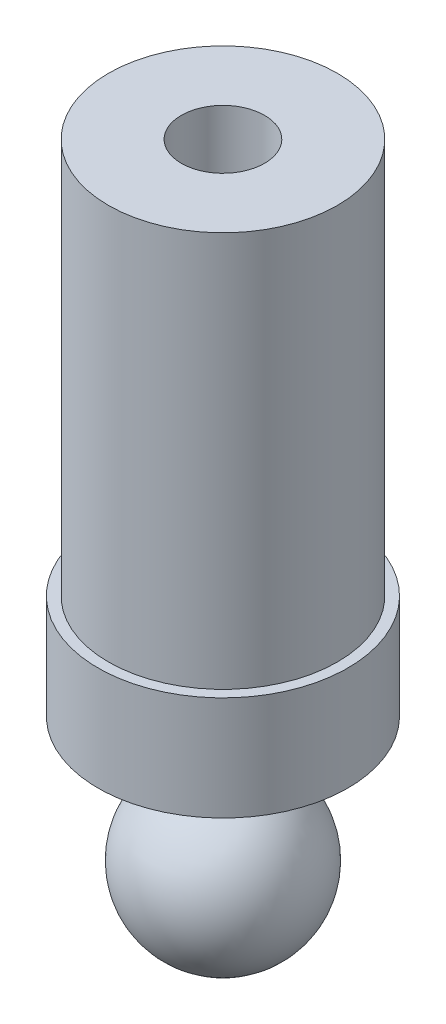
ISO-10303-21;
HEADER;
FILE_DESCRIPTION(('STEP AP214'),'2;1');
FILE_NAME('part.step','',(''),(''),'','','');
FILE_SCHEMA(('AUTOMOTIVE_DESIGN { 1 0 10303 214 1 1 1 1 }'));
ENDSEC;
DATA;
#1=APPLICATION_CONTEXT('core data for automotive mechanical design processes');
#2=APPLICATION_PROTOCOL_DEFINITION('international standard','automotive_design',2000,#1);
#3=PRODUCT_CONTEXT('',#1,'mechanical');
#4=PRODUCT('Part','Part','',(#3));
#5=PRODUCT_RELATED_PRODUCT_CATEGORY('part','',(#4));
#6=PRODUCT_DEFINITION_FORMATION('','',#4);
#7=PRODUCT_DEFINITION_CONTEXT('part definition',#1,'design');
#8=PRODUCT_DEFINITION('design','',#6,#7);
#9=PRODUCT_DEFINITION_SHAPE('','',#8);
#10=(LENGTH_UNIT() NAMED_UNIT(*) SI_UNIT(.MILLI.,.METRE.));
#11=(NAMED_UNIT(*) PLANE_ANGLE_UNIT() SI_UNIT($,.RADIAN.));
#12=(NAMED_UNIT(*) SI_UNIT($,.STERADIAN.) SOLID_ANGLE_UNIT());
#13=UNCERTAINTY_MEASURE_WITH_UNIT(LENGTH_MEASURE(1.E-05),#10,'distance_accuracy_value','');
#14=(GEOMETRIC_REPRESENTATION_CONTEXT(3) GLOBAL_UNCERTAINTY_ASSIGNED_CONTEXT((#13)) GLOBAL_UNIT_ASSIGNED_CONTEXT((#10,
#11,#12)) REPRESENTATION_CONTEXT('',''));
#15=CARTESIAN_POINT('',(0.,0.,0.));
#16=DIRECTION('',(0.,0.,1.));
#17=DIRECTION('',(1.,0.,0.));
#18=AXIS2_PLACEMENT_3D('',#15,#16,#17);
#19=CARTESIAN_POINT('',(0.,-3.,0.));
#20=DIRECTION('',(0.,1.,0.));
#21=DIRECTION('',(0.,0.,1.));
#22=AXIS2_PLACEMENT_3D('',#19,#20,#21);
#23=CYLINDRICAL_SURFACE('',#22,2.);
#24=CARTESIAN_POINT('',(0.,0.,0.));
#25=DIRECTION('',(0.,-1.,0.));
#26=DIRECTION('',(0.,0.,-1.));
#27=AXIS2_PLACEMENT_3D('',#24,#25,#26);
#28=CIRCLE('',#27,2.);
#29=CARTESIAN_POINT('',(0.,0.,-2.));
#30=VERTEX_POINT('',#29);
#31=EDGE_CURVE('E45',#30,#30,#28,.T.);
#32=ORIENTED_EDGE('',*,*,#31,.T.);
#33=EDGE_LOOP('',(#32));
#34=FACE_BOUND('',#33,.T.);
#35=CARTESIAN_POINT('',(0.,-2.53589838486224,0.));
#36=DIRECTION('',(0.,-1.,0.));
#37=DIRECTION('',(0.,0.,-1.));
#38=AXIS2_PLACEMENT_3D('',#35,#36,#37);
#39=CIRCLE('',#38,2.);
#40=CARTESIAN_POINT('',(0.,-2.53589838486224,-2.));
#41=VERTEX_POINT('',#40);
#42=EDGE_CURVE('E11',#41,#41,#39,.T.);
#43=ORIENTED_EDGE('',*,*,#42,.F.);
#44=EDGE_LOOP('',(#43));
#45=FACE_BOUND('',#44,.T.);
#46=ADVANCED_FACE('F39',(#34,#45),#23,.T.);
#47=CARTESIAN_POINT('',(0.,0.,0.));
#48=DIRECTION('',(0.,-1.,0.));
#49=DIRECTION('',(0.,0.,-1.));
#50=AXIS2_PLACEMENT_3D('',#47,#48,#49);
#51=PLANE('',#50);
#52=ORIENTED_EDGE('',*,*,#31,.F.);
#53=EDGE_LOOP('',(#52));
#54=FACE_BOUND('',#53,.T.);
#55=ADVANCED_FACE('F53',(#54),#51,.F.);
#56=CARTESIAN_POINT('',(0.,-6.,0.));
#57=DIRECTION('',(-1.,0.,0.));
#58=DIRECTION('',(0.,0.,-1.));
#59=AXIS2_PLACEMENT_3D('',#56,#57,#58);
#60=SPHERICAL_SURFACE('',#59,4.);
#61=CARTESIAN_POINT('',(0.,-6.,0.));
#62=DIRECTION('',(0.,-1.,0.));
#63=DIRECTION('',(0.,0.,-1.));
#64=AXIS2_PLACEMENT_3D('',#61,#62,#63);
#65=SPHERICAL_SURFACE('',#64,4.);
#66=ORIENTED_EDGE('',*,*,#42,.T.);
#67=EDGE_LOOP('',(#66));
#68=FACE_BOUND('',#67,.T.);
#69=ADVANCED_FACE('F55',(#68),#65,.T.);
#70=CLOSED_SHELL('',(#46,#55,#69));
#71=MANIFOLD_SOLID_BREP('B2',#70);
#72=CARTESIAN_POINT('',(0.,45.,0.));
#73=DIRECTION('',(0.,-1.,0.));
#74=DIRECTION('',(0.,0.,-1.));
#75=AXIS2_PLACEMENT_3D('',#72,#73,#74);
#76=CYLINDRICAL_SURFACE('',#75,6.);
#77=CARTESIAN_POINT('',(0.,0.,0.));
#78=DIRECTION('',(0.,1.,0.));
#79=DIRECTION('',(0.,0.,1.));
#80=AXIS2_PLACEMENT_3D('',#77,#78,#79);
#81=CIRCLE('',#80,6.);
#82=CARTESIAN_POINT('',(0.,0.,-6.));
#83=VERTEX_POINT('',#82);
#84=EDGE_CURVE('E38',#83,#83,#81,.T.);
#85=CARTESIAN_POINT('',(0.,5.,0.));
#86=DIRECTION('',(0.,1.,0.));
#87=DIRECTION('',(0.,0.,1.));
#88=AXIS2_PLACEMENT_3D('',#85,#86,#87);
#89=CIRCLE('',#88,6.);
#90=CARTESIAN_POINT('',(0.,5.,-6.));
#91=VERTEX_POINT('',#90);
#92=EDGE_CURVE('E92',#91,#91,#89,.T.);
#93=CARTESIAN_POINT('',(0.,0.,-6.));
#94=CARTESIAN_POINT('',(0.,0.0520833333333253,-6.));
#95=CARTESIAN_POINT('',(0.,0.104166666666657,-6.));
#96=CARTESIAN_POINT('',(0.,0.208333333333324,-6.));
#97=CARTESIAN_POINT('',(0.,0.260416666666659,-6.));
#98=CARTESIAN_POINT('',(0.,0.364583333333328,-6.));
#99=CARTESIAN_POINT('',(0.,0.416666666666662,-6.));
#100=CARTESIAN_POINT('',(0.,0.520833333333329,-6.));
#101=CARTESIAN_POINT('',(0.,0.572916666666661,-6.));
#102=CARTESIAN_POINT('',(0.,0.677083333333326,-6.));
#103=CARTESIAN_POINT('',(0.,0.729166666666658,-6.));
#104=CARTESIAN_POINT('',(0.,0.833333333333325,-6.));
#105=CARTESIAN_POINT('',(0.,0.885416666666659,-6.));
#106=CARTESIAN_POINT('',(0.,0.989583333333328,-6.));
#107=CARTESIAN_POINT('',(0.,1.04166666666666,-6.));
#108=CARTESIAN_POINT('',(0.,1.14583333333333,-6.));
#109=CARTESIAN_POINT('',(0.,1.19791666666666,-6.));
#110=CARTESIAN_POINT('',(0.,1.30208333333333,-6.));
#111=CARTESIAN_POINT('',(0.,1.35416666666666,-6.));
#112=CARTESIAN_POINT('',(0.,1.45833333333333,-6.));
#113=CARTESIAN_POINT('',(0.,1.51041666666666,-6.));
#114=CARTESIAN_POINT('',(0.,1.61458333333333,-6.));
#115=CARTESIAN_POINT('',(0.,1.66666666666666,-6.));
#116=CARTESIAN_POINT('',(0.,1.77083333333333,-6.));
#117=CARTESIAN_POINT('',(0.,1.82291666666666,-6.));
#118=CARTESIAN_POINT('',(0.,1.92708333333333,-6.));
#119=CARTESIAN_POINT('',(0.,1.97916666666666,-6.));
#120=CARTESIAN_POINT('',(0.,2.08333333333333,-6.));
#121=CARTESIAN_POINT('',(0.,2.13541666666666,-6.));
#122=CARTESIAN_POINT('',(0.,2.23958333333333,-6.));
#123=CARTESIAN_POINT('',(0.,2.29166666666666,-6.));
#124=CARTESIAN_POINT('',(0.,2.39583333333333,-6.));
#125=CARTESIAN_POINT('',(0.,2.44791666666666,-6.));
#126=CARTESIAN_POINT('',(0.,2.55208333333333,-6.));
#127=CARTESIAN_POINT('',(0.,2.60416666666666,-6.));
#128=CARTESIAN_POINT('',(0.,2.70833333333333,-6.));
#129=CARTESIAN_POINT('',(0.,2.76041666666666,-6.));
#130=CARTESIAN_POINT('',(0.,2.86458333333333,-6.));
#131=CARTESIAN_POINT('',(0.,2.91666666666666,-6.));
#132=CARTESIAN_POINT('',(0.,3.02083333333333,-6.));
#133=CARTESIAN_POINT('',(0.,3.07291666666666,-6.));
#134=CARTESIAN_POINT('',(0.,3.17708333333333,-6.));
#135=CARTESIAN_POINT('',(0.,3.22916666666666,-6.));
#136=CARTESIAN_POINT('',(0.,3.33333333333333,-6.));
#137=CARTESIAN_POINT('',(0.,3.38541666666666,-6.));
#138=CARTESIAN_POINT('',(0.,3.48958333333333,-6.));
#139=CARTESIAN_POINT('',(0.,3.54166666666667,-6.));
#140=CARTESIAN_POINT('',(0.,3.64583333333333,-6.));
#141=CARTESIAN_POINT('',(0.,3.69791666666666,-6.));
#142=CARTESIAN_POINT('',(0.,3.80208333333333,-6.));
#143=CARTESIAN_POINT('',(0.,3.85416666666666,-6.));
#144=CARTESIAN_POINT('',(0.,3.95833333333333,-6.));
#145=CARTESIAN_POINT('',(0.,4.01041666666666,-6.));
#146=CARTESIAN_POINT('',(0.,4.11458333333333,-6.));
#147=CARTESIAN_POINT('',(0.,4.16666666666667,-6.));
#148=CARTESIAN_POINT('',(0.,4.27083333333333,-6.));
#149=CARTESIAN_POINT('',(0.,4.32291666666667,-6.));
#150=CARTESIAN_POINT('',(0.,4.42708333333333,-6.));
#151=CARTESIAN_POINT('',(0.,4.47916666666666,-6.));
#152=CARTESIAN_POINT('',(0.,4.58333333333333,-6.));
#153=CARTESIAN_POINT('',(0.,4.63541666666666,-6.));
#154=CARTESIAN_POINT('',(0.,4.73958333333333,-6.));
#155=CARTESIAN_POINT('',(0.,4.79166666666667,-6.));
#156=CARTESIAN_POINT('',(0.,4.89583333333333,-6.));
#157=CARTESIAN_POINT('',(0.,4.94791666666667,-6.));
#158=CARTESIAN_POINT('',(0.,5.,-6.));
#159=B_SPLINE_CURVE_WITH_KNOTS('',3,(#93,#94,#95,#96,#97,#98,#99,#100,#101,#102,#103,#104,#105,
#106,#107,#108,#109,#110,#111,#112,#113,#114,#115,#116,#117,#118,#119,#120,#121,#122,#123,#124,
#125,#126,#127,#128,#129,#130,#131,#132,#133,#134,#135,#136,#137,#138,#139,#140,#141,#142,#143,
#144,#145,#146,#147,#148,#149,#150,#151,#152,#153,#154,#155,#156,#157,#158),.UNSPECIFIED.,.F.,
.F.,(4,2,2,2,2,2,2,2,2,2,2,2,2,2,2,2,2,2,2,2,2,2,2,2,2,2,2,2,2,2,2,2,4),(0.,0.156249999999997,
0.3125,0.468750000000004,0.625000000000001,0.781249999999997,0.937500000000001,1.09375,1.25,
1.40625,1.5625,1.71875,1.875,2.03125,2.1875,2.34375000000001,2.5,2.65625,2.8125,
2.96875000000001,3.125,3.28125,3.4375,3.59375000000001,3.75,3.90625,4.0625,4.21875000000001,
4.375,4.53125,4.6875,4.84375000000001,5.),.UNSPECIFIED.);
#160=EDGE_CURVE('BSEAM80',#83,#91,#159,.T.);
#161=ORIENTED_EDGE('',*,*,#84,.T.);
#162=ORIENTED_EDGE('',*,*,#92,.F.);
#163=ORIENTED_EDGE('',*,*,#160,.T.);
#164=ORIENTED_EDGE('',*,*,#160,.F.);
#165=EDGE_LOOP('',(#161,#163,#162,#164));
#166=FACE_BOUND('',#165,.T.);
#167=ADVANCED_FACE('F80',(#166),#76,.T.);
#168=CARTESIAN_POINT('',(0.,0.,0.));
#169=DIRECTION('',(0.,1.,0.));
#170=DIRECTION('',(0.,0.,1.));
#171=AXIS2_PLACEMENT_3D('',#168,#169,#170);
#172=PLANE('',#171);
#173=CARTESIAN_POINT('',(0.,0.,0.));
#174=DIRECTION('',(0.,1.,0.));
#175=DIRECTION('',(0.,0.,1.));
#176=AXIS2_PLACEMENT_3D('',#173,#174,#175);
#177=CIRCLE('',#176,2.);
#178=CARTESIAN_POINT('',(0.,0.,2.));
#179=VERTEX_POINT('',#178);
#180=EDGE_CURVE('E99',#179,#179,#177,.T.);
#181=ORIENTED_EDGE('',*,*,#180,.T.);
#182=EDGE_LOOP('',(#181));
#183=FACE_BOUND('',#182,.T.);
#184=ORIENTED_EDGE('',*,*,#84,.F.);
#185=EDGE_LOOP('',(#184));
#186=FACE_BOUND('',#185,.T.);
#187=ADVANCED_FACE('F123',(#183,#186),#172,.F.);
#188=CARTESIAN_POINT('',(0.,5.,0.));
#189=DIRECTION('',(0.,1.,0.));
#190=DIRECTION('',(0.,0.,1.));
#191=AXIS2_PLACEMENT_3D('',#188,#189,#190);
#192=PLANE('',#191);
#193=ORIENTED_EDGE('',*,*,#92,.T.);
#194=EDGE_LOOP('',(#193));
#195=FACE_BOUND('',#194,.T.);
#196=CARTESIAN_POINT('',(0.,5.,0.));
#197=DIRECTION('',(0.,1.,0.));
#198=DIRECTION('',(0.,0.,1.));
#199=AXIS2_PLACEMENT_3D('',#196,#197,#198);
#200=CIRCLE('',#199,5.5);
#201=CARTESIAN_POINT('',(0.,5.,5.5));
#202=VERTEX_POINT('',#201);
#203=EDGE_CURVE('E96',#202,#202,#200,.T.);
#204=ORIENTED_EDGE('',*,*,#203,.F.);
#205=EDGE_LOOP('',(#204));
#206=FACE_BOUND('',#205,.T.);
#207=ADVANCED_FACE('F118',(#195,#206),#192,.T.);
#208=CARTESIAN_POINT('',(0.,43.,0.));
#209=DIRECTION('',(0.,-1.,0.));
#210=DIRECTION('',(0.,0.,-1.));
#211=AXIS2_PLACEMENT_3D('',#208,#209,#210);
#212=CYLINDRICAL_SURFACE('',#211,5.5);
#213=CARTESIAN_POINT('',(0.,24.,0.));
#214=DIRECTION('',(0.,1.,0.));
#215=DIRECTION('',(0.,0.,1.));
#216=AXIS2_PLACEMENT_3D('',#213,#214,#215);
#217=CIRCLE('',#216,5.5);
#218=CARTESIAN_POINT('',(0.,24.,5.5));
#219=VERTEX_POINT('',#218);
#220=EDGE_CURVE('E87',#219,#219,#217,.F.);
#221=ORIENTED_EDGE('',*,*,#220,.T.);
#222=EDGE_LOOP('',(#221));
#223=FACE_BOUND('',#222,.T.);
#224=ORIENTED_EDGE('',*,*,#203,.T.);
#225=EDGE_LOOP('',(#224));
#226=FACE_BOUND('',#225,.T.);
#227=ADVANCED_FACE('F112',(#223,#226),#212,.T.);
#228=CARTESIAN_POINT('',(0.,24.,0.));
#229=DIRECTION('',(0.,1.,0.));
#230=DIRECTION('',(0.,0.,1.));
#231=AXIS2_PLACEMENT_3D('',#228,#229,#230);
#232=PLANE('',#231);
#233=CARTESIAN_POINT('',(0.,24.,0.));
#234=DIRECTION('',(0.,1.,0.));
#235=DIRECTION('',(0.,0.,1.));
#236=AXIS2_PLACEMENT_3D('',#233,#234,#235);
#237=CIRCLE('',#236,2.);
#238=CARTESIAN_POINT('',(0.,24.,2.));
#239=VERTEX_POINT('',#238);
#240=EDGE_CURVE('E83',#239,#239,#237,.T.);
#241=ORIENTED_EDGE('',*,*,#240,.F.);
#242=EDGE_LOOP('',(#241));
#243=FACE_BOUND('',#242,.T.);
#244=ORIENTED_EDGE('',*,*,#220,.F.);
#245=EDGE_LOOP('',(#244));
#246=FACE_BOUND('',#245,.T.);
#247=ADVANCED_FACE('F109',(#243,#246),#232,.T.);
#248=CARTESIAN_POINT('',(0.,-11.,0.));
#249=DIRECTION('',(0.,1.,0.));
#250=DIRECTION('',(0.,0.,1.));
#251=AXIS2_PLACEMENT_3D('',#248,#249,#250);
#252=CYLINDRICAL_SURFACE('',#251,2.);
#253=ORIENTED_EDGE('',*,*,#240,.T.);
#254=EDGE_LOOP('',(#253));
#255=FACE_BOUND('',#254,.T.);
#256=ORIENTED_EDGE('',*,*,#180,.F.);
#257=EDGE_LOOP('',(#256));
#258=FACE_BOUND('',#257,.T.);
#259=ADVANCED_FACE('F106',(#255,#258),#252,.F.);
#260=CLOSED_SHELL('',(#167,#187,#207,#227,#247,#259));
#261=MANIFOLD_SOLID_BREP('B6',#260);
#262=ADVANCED_BREP_SHAPE_REPRESENTATION('',(#18,#71,#261),#14);
#263=SHAPE_DEFINITION_REPRESENTATION(#9,#262);
ENDSEC;
END-ISO-10303-21;
